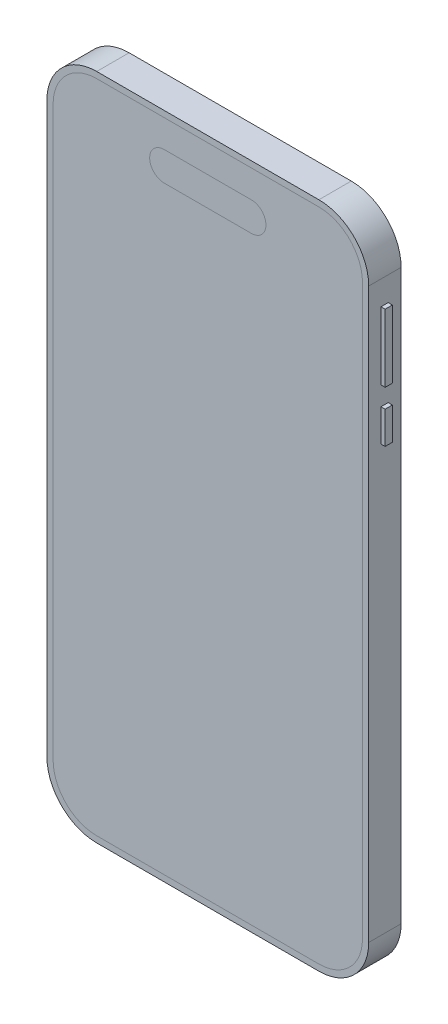
ISO-10303-21;
HEADER;
FILE_DESCRIPTION(('STEP AP214'),'2;1');
FILE_NAME('part.step','',(''),(''),'','','');
FILE_SCHEMA(('AUTOMOTIVE_DESIGN { 1 0 10303 214 1 1 1 1 }'));
ENDSEC;
DATA;
#1=APPLICATION_CONTEXT('core data for automotive mechanical design processes');
#2=APPLICATION_PROTOCOL_DEFINITION('international standard','automotive_design',2000,#1);
#3=PRODUCT_CONTEXT('',#1,'mechanical');
#4=PRODUCT('Part','Part','',(#3));
#5=PRODUCT_RELATED_PRODUCT_CATEGORY('part','',(#4));
#6=PRODUCT_DEFINITION_FORMATION('','',#4);
#7=PRODUCT_DEFINITION_CONTEXT('part definition',#1,'design');
#8=PRODUCT_DEFINITION('design','',#6,#7);
#9=PRODUCT_DEFINITION_SHAPE('','',#8);
#10=(LENGTH_UNIT() NAMED_UNIT(*) SI_UNIT(.MILLI.,.METRE.));
#11=(NAMED_UNIT(*) PLANE_ANGLE_UNIT() SI_UNIT($,.RADIAN.));
#12=(NAMED_UNIT(*) SI_UNIT($,.STERADIAN.) SOLID_ANGLE_UNIT());
#13=UNCERTAINTY_MEASURE_WITH_UNIT(LENGTH_MEASURE(1.E-05),#10,'distance_accuracy_value','');
#14=(GEOMETRIC_REPRESENTATION_CONTEXT(3) GLOBAL_UNCERTAINTY_ASSIGNED_CONTEXT((#13)) GLOBAL_UNIT_ASSIGNED_CONTEXT((#10,
#11,#12)) REPRESENTATION_CONTEXT('',''));
#15=CARTESIAN_POINT('',(0.,0.,0.));
#16=DIRECTION('',(0.,0.,1.));
#17=DIRECTION('',(1.,0.,0.));
#18=AXIS2_PLACEMENT_3D('',#15,#16,#17);
#19=CARTESIAN_POINT('',(38.75,-68.4499999999999,7.8));
#20=DIRECTION('',(-1.,0.,0.));
#21=DIRECTION('',(0.,0.,1.));
#22=AXIS2_PLACEMENT_3D('',#19,#20,#21);
#23=PLANE('',#22);
#24=DIRECTION('',(0.,1.,0.));
#25=VECTOR('',#24,1.);
#26=CARTESIAN_POINT('',(38.75,62.6491277311448,3.10781748503283));
#27=LINE('',#26,#25);
#28=CARTESIAN_POINT('',(38.75,46.3441915152805,3.10781748503283));
#29=VERTEX_POINT('',#28);
#30=CARTESIAN_POINT('',(38.75,62.6491277311448,3.10781748503283));
#31=VERTEX_POINT('',#30);
#32=EDGE_CURVE('E247',#29,#31,#27,.T.);
#33=ORIENTED_EDGE('',*,*,#32,.F.);
#34=DIRECTION('',(0.,0.,-1.));
#35=VECTOR('',#34,1.);
#36=CARTESIAN_POINT('',(38.75,46.3441915152805,4.84021695796844));
#37=LINE('',#36,#35);
#38=CARTESIAN_POINT('',(38.75,46.3441915152805,4.84021695796844));
#39=VERTEX_POINT('',#38);
#40=EDGE_CURVE('E280',#39,#29,#37,.T.);
#41=ORIENTED_EDGE('',*,*,#40,.F.);
#42=DIRECTION('',(0.,-1.,0.));
#43=VECTOR('',#42,1.);
#44=CARTESIAN_POINT('',(38.75,62.6491277311448,4.84021695796844));
#45=LINE('',#44,#43);
#46=CARTESIAN_POINT('',(38.75,62.6491277311448,4.84021695796844));
#47=VERTEX_POINT('',#46);
#48=EDGE_CURVE('E292',#47,#39,#45,.T.);
#49=ORIENTED_EDGE('',*,*,#48,.F.);
#50=DIRECTION('',(0.,0.,1.));
#51=VECTOR('',#50,1.);
#52=CARTESIAN_POINT('',(38.75,62.6491277311448,4.84021695796844));
#53=LINE('',#52,#51);
#54=EDGE_CURVE('E289',#31,#47,#53,.T.);
#55=ORIENTED_EDGE('',*,*,#54,.F.);
#56=EDGE_LOOP('',(#33,#41,#49,#55));
#57=FACE_BOUND('',#56,.T.);
#58=DIRECTION('',(0.,1.,0.));
#59=VECTOR('',#58,1.);
#60=CARTESIAN_POINT('',(38.75,-68.4499999999999,0.));
#61=LINE('',#60,#59);
#62=CARTESIAN_POINT('',(38.75,-68.4499999999999,0.));
#63=VERTEX_POINT('',#62);
#64=CARTESIAN_POINT('',(38.75,68.4499999999999,0.));
#65=VERTEX_POINT('',#64);
#66=EDGE_CURVE('E409',#63,#65,#61,.T.);
#67=ORIENTED_EDGE('',*,*,#66,.T.);
#68=DIRECTION('',(0.,0.,-1.));
#69=VECTOR('',#68,1.);
#70=CARTESIAN_POINT('',(38.75,68.4499999999999,7.8));
#71=LINE('',#70,#69);
#72=CARTESIAN_POINT('',(38.75,68.4499999999999,7.8));
#73=VERTEX_POINT('',#72);
#74=EDGE_CURVE('E439',#73,#65,#71,.T.);
#75=ORIENTED_EDGE('',*,*,#74,.F.);
#76=DIRECTION('',(0.,1.,0.));
#77=VECTOR('',#76,1.);
#78=CARTESIAN_POINT('',(38.75,-68.4499999999999,7.8));
#79=LINE('',#78,#77);
#80=CARTESIAN_POINT('',(38.75,-68.4499999999999,7.8));
#81=VERTEX_POINT('',#80);
#82=EDGE_CURVE('E391',#81,#73,#79,.T.);
#83=ORIENTED_EDGE('',*,*,#82,.F.);
#84=DIRECTION('',(0.,0.,-1.));
#85=VECTOR('',#84,1.);
#86=CARTESIAN_POINT('',(38.75,-68.4499999999999,7.8));
#87=LINE('',#86,#85);
#88=EDGE_CURVE('E442',#81,#63,#87,.T.);
#89=ORIENTED_EDGE('',*,*,#88,.T.);
#90=EDGE_LOOP('',(#67,#75,#83,#89));
#91=FACE_BOUND('',#90,.T.);
#92=DIRECTION('',(0.,1.,0.));
#93=VECTOR('',#92,1.);
#94=CARTESIAN_POINT('',(38.75,34.014462440001,3.10781748503283));
#95=LINE('',#94,#93);
#96=CARTESIAN_POINT('',(38.75,34.014462440001,3.10781748503283));
#97=VERTEX_POINT('',#96);
#98=CARTESIAN_POINT('',(38.75,41.7959932490222,3.10781748503283));
#99=VERTEX_POINT('',#98);
#100=EDGE_CURVE('E241',#97,#99,#95,.T.);
#101=ORIENTED_EDGE('',*,*,#100,.F.);
#102=DIRECTION('',(0.,0.,-1.));
#103=VECTOR('',#102,1.);
#104=CARTESIAN_POINT('',(38.75,34.014462440001,4.84021695796844));
#105=LINE('',#104,#103);
#106=CARTESIAN_POINT('',(38.75,34.014462440001,4.84021695796844));
#107=VERTEX_POINT('',#106);
#108=EDGE_CURVE('E243',#107,#97,#105,.T.);
#109=ORIENTED_EDGE('',*,*,#108,.F.);
#110=DIRECTION('',(0.,-1.,0.));
#111=VECTOR('',#110,1.);
#112=CARTESIAN_POINT('',(38.75,34.014462440001,4.84021695796844));
#113=LINE('',#112,#111);
#114=CARTESIAN_POINT('',(38.75,41.7959932490222,4.84021695796844));
#115=VERTEX_POINT('',#114);
#116=EDGE_CURVE('E68',#115,#107,#113,.T.);
#117=ORIENTED_EDGE('',*,*,#116,.F.);
#118=DIRECTION('',(0.,0.,1.));
#119=VECTOR('',#118,1.);
#120=CARTESIAN_POINT('',(38.75,41.7959932490222,4.84021695796844));
#121=LINE('',#120,#119);
#122=EDGE_CURVE('E63',#99,#115,#121,.T.);
#123=ORIENTED_EDGE('',*,*,#122,.F.);
#124=EDGE_LOOP('',(#101,#109,#117,#123));
#125=FACE_BOUND('',#124,.T.);
#126=ADVANCED_FACE('F47',(#57,#91,#125),#23,.F.);
#127=CARTESIAN_POINT('',(0.,0.,-4.));
#128=DIRECTION('',(0.,0.,-1.));
#129=DIRECTION('',(-1.,0.,0.));
#130=AXIS2_PLACEMENT_3D('',#127,#128,#129);
#131=PLANE('',#130);
#132=CARTESIAN_POINT('',(24.5442286340599,47.45,-4.));
#133=DIRECTION('',(0.,0.,-1.));
#134=DIRECTION('',(-1.,0.,0.));
#135=AXIS2_PLACEMENT_3D('',#132,#133,#134);
#136=CIRCLE('',#135,7.5);
#137=CARTESIAN_POINT('',(17.0442286340599,47.45,-4.));
#138=VERTEX_POINT('',#137);
#139=EDGE_CURVE('E316',#138,#138,#136,.T.);
#140=ORIENTED_EDGE('',*,*,#139,.T.);
#141=EDGE_LOOP('',(#140));
#142=FACE_BOUND('',#141,.T.);
#143=CARTESIAN_POINT('',(24.5442286340599,47.45,-4.));
#144=DIRECTION('',(0.,0.,-1.));
#145=DIRECTION('',(-1.,0.,0.));
#146=AXIS2_PLACEMENT_3D('',#143,#144,#145);
#147=CIRCLE('',#146,6.5);
#148=CARTESIAN_POINT('',(18.0442286340599,47.45,-4.));
#149=VERTEX_POINT('',#148);
#150=EDGE_CURVE('E11',#149,#149,#147,.F.);
#151=ORIENTED_EDGE('',*,*,#150,.T.);
#152=EDGE_LOOP('',(#151));
#153=FACE_BOUND('',#152,.T.);
#154=ADVANCED_FACE('F527',(#142,#153),#131,.T.);
#155=CARTESIAN_POINT('',(0.,0.,-4.));
#156=DIRECTION('',(0.,0.,-1.));
#157=DIRECTION('',(-1.,0.,0.));
#158=AXIS2_PLACEMENT_3D('',#155,#156,#157);
#159=PLANE('',#158);
#160=CARTESIAN_POINT('',(8.95577136594005,56.45,-4.));
#161=DIRECTION('',(0.,0.,-1.));
#162=DIRECTION('',(-1.,0.,0.));
#163=AXIS2_PLACEMENT_3D('',#160,#161,#162);
#164=CIRCLE('',#163,7.5);
#165=CARTESIAN_POINT('',(1.45577136594005,56.45,-4.));
#166=VERTEX_POINT('',#165);
#167=EDGE_CURVE('E312',#166,#166,#164,.T.);
#168=ORIENTED_EDGE('',*,*,#167,.T.);
#169=EDGE_LOOP('',(#168));
#170=FACE_BOUND('',#169,.T.);
#171=CARTESIAN_POINT('',(8.95577136594005,56.45,-4.));
#172=DIRECTION('',(0.,0.,-1.));
#173=DIRECTION('',(-1.,0.,0.));
#174=AXIS2_PLACEMENT_3D('',#171,#172,#173);
#175=CIRCLE('',#174,6.5);
#176=CARTESIAN_POINT('',(2.45577136594005,56.45,-4.));
#177=VERTEX_POINT('',#176);
#178=EDGE_CURVE('E56',#177,#177,#175,.F.);
#179=ORIENTED_EDGE('',*,*,#178,.T.);
#180=EDGE_LOOP('',(#179));
#181=FACE_BOUND('',#180,.T.);
#182=ADVANCED_FACE('F508',(#170,#181),#159,.T.);
#183=CARTESIAN_POINT('',(0.,0.,-4.));
#184=DIRECTION('',(0.,0.,-1.));
#185=DIRECTION('',(-1.,0.,0.));
#186=AXIS2_PLACEMENT_3D('',#183,#184,#185);
#187=PLANE('',#186);
#188=CARTESIAN_POINT('',(24.5442286340599,65.45,-4.));
#189=DIRECTION('',(0.,0.,-1.));
#190=DIRECTION('',(-1.,0.,0.));
#191=AXIS2_PLACEMENT_3D('',#188,#189,#190);
#192=CIRCLE('',#191,7.5);
#193=CARTESIAN_POINT('',(17.0442286340599,65.45,-4.));
#194=VERTEX_POINT('',#193);
#195=EDGE_CURVE('E320',#194,#194,#192,.T.);
#196=ORIENTED_EDGE('',*,*,#195,.T.);
#197=EDGE_LOOP('',(#196));
#198=FACE_BOUND('',#197,.T.);
#199=CARTESIAN_POINT('',(24.5442286340599,65.45,-4.));
#200=DIRECTION('',(0.,0.,-1.));
#201=DIRECTION('',(-1.,0.,0.));
#202=AXIS2_PLACEMENT_3D('',#199,#200,#201);
#203=CIRCLE('',#202,6.5);
#204=CARTESIAN_POINT('',(18.0442286340599,65.45,-4.));
#205=VERTEX_POINT('',#204);
#206=EDGE_CURVE('E491',#205,#205,#203,.F.);
#207=ORIENTED_EDGE('',*,*,#206,.T.);
#208=EDGE_LOOP('',(#207));
#209=FACE_BOUND('',#208,.T.);
#210=ADVANCED_FACE('F526',(#198,#209),#187,.T.);
#211=CARTESIAN_POINT('',(26.75,-68.45,7.8));
#212=DIRECTION('',(0.,0.,1.));
#213=DIRECTION('',(1.,0.,0.));
#214=AXIS2_PLACEMENT_3D('',#211,#212,#213);
#215=PLANE('',#214);
#216=CARTESIAN_POINT('',(26.75,-68.45,7.8));
#217=DIRECTION('',(0.,0.,1.));
#218=DIRECTION('',(1.,0.,0.));
#219=AXIS2_PLACEMENT_3D('',#216,#217,#218);
#220=CIRCLE('',#219,12.);
#221=CARTESIAN_POINT('',(26.7499999999999,-80.45,7.8));
#222=VERTEX_POINT('',#221);
#223=EDGE_CURVE('E388',#222,#81,#220,.T.);
#224=ORIENTED_EDGE('',*,*,#223,.T.);
#225=ORIENTED_EDGE('',*,*,#82,.T.);
#226=CARTESIAN_POINT('',(26.75,68.45,7.8));
#227=DIRECTION('',(0.,0.,1.));
#228=DIRECTION('',(-1.,0.,0.));
#229=AXIS2_PLACEMENT_3D('',#226,#227,#228);
#230=CIRCLE('',#229,12.);
#231=CARTESIAN_POINT('',(26.7499999999999,80.45,7.8));
#232=VERTEX_POINT('',#231);
#233=EDGE_CURVE('E394',#73,#232,#230,.T.);
#234=ORIENTED_EDGE('',*,*,#233,.T.);
#235=DIRECTION('',(-1.,0.,0.));
#236=VECTOR('',#235,1.);
#237=CARTESIAN_POINT('',(-26.7499999999999,80.45,7.8));
#238=LINE('',#237,#236);
#239=CARTESIAN_POINT('',(-26.7499999999999,80.45,7.8));
#240=VERTEX_POINT('',#239);
#241=EDGE_CURVE('E396',#232,#240,#238,.T.);
#242=ORIENTED_EDGE('',*,*,#241,.T.);
#243=CARTESIAN_POINT('',(-26.75,68.45,7.8));
#244=DIRECTION('',(0.,0.,1.));
#245=DIRECTION('',(-1.,0.,0.));
#246=AXIS2_PLACEMENT_3D('',#243,#244,#245);
#247=CIRCLE('',#246,12.);
#248=CARTESIAN_POINT('',(-38.75,68.4499999999999,7.8));
#249=VERTEX_POINT('',#248);
#250=EDGE_CURVE('E398',#240,#249,#247,.T.);
#251=ORIENTED_EDGE('',*,*,#250,.T.);
#252=DIRECTION('',(0.,-1.,0.));
#253=VECTOR('',#252,1.);
#254=CARTESIAN_POINT('',(-38.75,-68.4499999999999,7.8));
#255=LINE('',#254,#253);
#256=CARTESIAN_POINT('',(-38.75,-68.45,7.8));
#257=VERTEX_POINT('',#256);
#258=EDGE_CURVE('E400',#249,#257,#255,.T.);
#259=ORIENTED_EDGE('',*,*,#258,.T.);
#260=CARTESIAN_POINT('',(-26.75,-68.45,7.8));
#261=DIRECTION('',(0.,0.,1.));
#262=DIRECTION('',(-1.,0.,0.));
#263=AXIS2_PLACEMENT_3D('',#260,#261,#262);
#264=CIRCLE('',#263,12.);
#265=CARTESIAN_POINT('',(-26.7499999999999,-80.45,7.8));
#266=VERTEX_POINT('',#265);
#267=EDGE_CURVE('E402',#257,#266,#264,.T.);
#268=ORIENTED_EDGE('',*,*,#267,.T.);
#269=DIRECTION('',(1.,0.,0.));
#270=VECTOR('',#269,1.);
#271=CARTESIAN_POINT('',(-26.7499999999999,-80.45,7.8));
#272=LINE('',#271,#270);
#273=EDGE_CURVE('E404',#266,#222,#272,.T.);
#274=ORIENTED_EDGE('',*,*,#273,.T.);
#275=EDGE_LOOP('',(#224,#225,#234,#242,#251,#259,#268,#274));
#276=FACE_BOUND('',#275,.T.);
#277=DIRECTION('',(0.,1.,0.));
#278=VECTOR('',#277,1.);
#279=CARTESIAN_POINT('',(-37.25,-68.45,7.8));
#280=LINE('',#279,#278);
#281=CARTESIAN_POINT('',(-37.25,-68.45,7.8));
#282=VERTEX_POINT('',#281);
#283=CARTESIAN_POINT('',(-37.25,68.4499999999999,7.8));
#284=VERTEX_POINT('',#283);
#285=EDGE_CURVE('E484',#282,#284,#280,.T.);
#286=ORIENTED_EDGE('',*,*,#285,.T.);
#287=CARTESIAN_POINT('',(-26.75,68.45,7.8));
#288=DIRECTION('',(0.,0.,1.));
#289=DIRECTION('',(1.,0.,0.));
#290=AXIS2_PLACEMENT_3D('',#287,#288,#289);
#291=CIRCLE('',#290,10.5);
#292=CARTESIAN_POINT('',(-26.7499999999999,78.95,7.8));
#293=VERTEX_POINT('',#292);
#294=EDGE_CURVE('E488',#284,#293,#291,.F.);
#295=ORIENTED_EDGE('',*,*,#294,.T.);
#296=DIRECTION('',(1.,0.,0.));
#297=VECTOR('',#296,1.);
#298=CARTESIAN_POINT('',(26.75,78.95,7.8));
#299=LINE('',#298,#297);
#300=CARTESIAN_POINT('',(26.7499999999999,78.95,7.8));
#301=VERTEX_POINT('',#300);
#302=EDGE_CURVE('E460',#293,#301,#299,.T.);
#303=ORIENTED_EDGE('',*,*,#302,.T.);
#304=CARTESIAN_POINT('',(26.75,68.45,7.8));
#305=DIRECTION('',(0.,0.,1.));
#306=DIRECTION('',(1.,0.,0.));
#307=AXIS2_PLACEMENT_3D('',#304,#305,#306);
#308=CIRCLE('',#307,10.5);
#309=CARTESIAN_POINT('',(37.25,68.45,7.8));
#310=VERTEX_POINT('',#309);
#311=EDGE_CURVE('E464',#301,#310,#308,.F.);
#312=ORIENTED_EDGE('',*,*,#311,.T.);
#313=DIRECTION('',(0.,-1.,0.));
#314=VECTOR('',#313,1.);
#315=CARTESIAN_POINT('',(37.25,-68.45,7.8));
#316=LINE('',#315,#314);
#317=CARTESIAN_POINT('',(37.25,-68.45,7.8));
#318=VERTEX_POINT('',#317);
#319=EDGE_CURVE('E468',#310,#318,#316,.T.);
#320=ORIENTED_EDGE('',*,*,#319,.T.);
#321=CARTESIAN_POINT('',(26.75,-68.45,7.8));
#322=DIRECTION('',(0.,0.,1.));
#323=DIRECTION('',(1.,0.,0.));
#324=AXIS2_PLACEMENT_3D('',#321,#322,#323);
#325=CIRCLE('',#324,10.5);
#326=CARTESIAN_POINT('',(26.7499999999999,-78.95,7.8));
#327=VERTEX_POINT('',#326);
#328=EDGE_CURVE('E472',#318,#327,#325,.F.);
#329=ORIENTED_EDGE('',*,*,#328,.T.);
#330=DIRECTION('',(-1.,0.,0.));
#331=VECTOR('',#330,1.);
#332=CARTESIAN_POINT('',(26.75,-78.95,7.8));
#333=LINE('',#332,#331);
#334=CARTESIAN_POINT('',(-26.7499999999999,-78.95,7.8));
#335=VERTEX_POINT('',#334);
#336=EDGE_CURVE('E476',#327,#335,#333,.T.);
#337=ORIENTED_EDGE('',*,*,#336,.T.);
#338=CARTESIAN_POINT('',(-26.75,-68.45,7.8));
#339=DIRECTION('',(0.,0.,1.));
#340=DIRECTION('',(1.,0.,0.));
#341=AXIS2_PLACEMENT_3D('',#338,#339,#340);
#342=CIRCLE('',#341,10.5);
#343=EDGE_CURVE('E480',#335,#282,#342,.F.);
#344=ORIENTED_EDGE('',*,*,#343,.T.);
#345=EDGE_LOOP('',(#286,#295,#303,#312,#320,#329,#337,#344));
#346=FACE_BOUND('',#345,.T.);
#347=ADVANCED_FACE('F572',(#276,#346),#215,.T.);
#348=ORIENTED_EDGE('',*,*,#294,.F.);
#349=ORIENTED_EDGE('',*,*,#285,.F.);
#350=ORIENTED_EDGE('',*,*,#343,.F.);
#351=ORIENTED_EDGE('',*,*,#336,.F.);
#352=ORIENTED_EDGE('',*,*,#328,.F.);
#353=ORIENTED_EDGE('',*,*,#319,.F.);
#354=ORIENTED_EDGE('',*,*,#311,.F.);
#355=ORIENTED_EDGE('',*,*,#302,.F.);
#356=EDGE_LOOP('',(#348,#349,#350,#351,#352,#353,#354,#355));
#357=FACE_BOUND('',#356,.T.);
#358=DIRECTION('',(-1.,0.,0.));
#359=VECTOR('',#358,1.);
#360=CARTESIAN_POINT('',(26.7500000000001,65.3,7.8));
#361=LINE('',#360,#359);
#362=CARTESIAN_POINT('',(10.5,65.3,7.8));
#363=VERTEX_POINT('',#362);
#364=CARTESIAN_POINT('',(-10.5,65.3,7.8));
#365=VERTEX_POINT('',#364);
#366=EDGE_CURVE('E453',#363,#365,#361,.T.);
#367=ORIENTED_EDGE('',*,*,#366,.T.);
#368=CARTESIAN_POINT('',(-10.5,68.8,7.8));
#369=DIRECTION('',(0.,0.,1.));
#370=DIRECTION('',(1.,0.,0.));
#371=AXIS2_PLACEMENT_3D('',#368,#369,#370);
#372=CIRCLE('',#371,3.5);
#373=CARTESIAN_POINT('',(-10.5,72.3,7.8));
#374=VERTEX_POINT('',#373);
#375=EDGE_CURVE('E457',#365,#374,#372,.F.);
#376=ORIENTED_EDGE('',*,*,#375,.T.);
#377=DIRECTION('',(1.,0.,0.));
#378=VECTOR('',#377,1.);
#379=CARTESIAN_POINT('',(26.7499999999999,72.3,7.8));
#380=LINE('',#379,#378);
#381=CARTESIAN_POINT('',(10.5,72.3,7.8));
#382=VERTEX_POINT('',#381);
#383=EDGE_CURVE('E445',#374,#382,#380,.T.);
#384=ORIENTED_EDGE('',*,*,#383,.T.);
#385=CARTESIAN_POINT('',(10.5,68.8,7.8));
#386=DIRECTION('',(0.,0.,1.));
#387=DIRECTION('',(1.,0.,0.));
#388=AXIS2_PLACEMENT_3D('',#385,#386,#387);
#389=CIRCLE('',#388,3.50000000000002);
#390=EDGE_CURVE('E449',#382,#363,#389,.F.);
#391=ORIENTED_EDGE('',*,*,#390,.T.);
#392=EDGE_LOOP('',(#367,#376,#384,#391));
#393=FACE_BOUND('',#392,.T.);
#394=ADVANCED_FACE('F573',(#357,#393),#215,.T.);
#395=CARTESIAN_POINT('',(26.75,-68.45,7.8));
#396=DIRECTION('',(0.,0.,-1.));
#397=DIRECTION('',(-1.,0.,0.));
#398=AXIS2_PLACEMENT_3D('',#395,#396,#397);
#399=CYLINDRICAL_SURFACE('',#398,12.);
#400=CARTESIAN_POINT('',(26.75,-68.45,0.));
#401=DIRECTION('',(0.,0.,1.));
#402=DIRECTION('',(1.,0.,0.));
#403=AXIS2_PLACEMENT_3D('',#400,#401,#402);
#404=CIRCLE('',#403,12.);
#405=CARTESIAN_POINT('',(26.7499999999999,-80.45,0.));
#406=VERTEX_POINT('',#405);
#407=EDGE_CURVE('E387',#406,#63,#404,.T.);
#408=ORIENTED_EDGE('',*,*,#407,.T.);
#409=ORIENTED_EDGE('',*,*,#88,.F.);
#410=ORIENTED_EDGE('',*,*,#223,.F.);
#411=DIRECTION('',(0.,0.,-1.));
#412=VECTOR('',#411,1.);
#413=CARTESIAN_POINT('',(26.7499999999999,-80.45,7.8));
#414=LINE('',#413,#412);
#415=EDGE_CURVE('E406',#222,#406,#414,.T.);
#416=ORIENTED_EDGE('',*,*,#415,.T.);
#417=EDGE_LOOP('',(#408,#409,#410,#416));
#418=FACE_BOUND('',#417,.T.);
#419=ADVANCED_FACE('F49',(#418),#399,.T.);
#420=CARTESIAN_POINT('',(26.75,68.45,7.8));
#421=DIRECTION('',(0.,0.,-1.));
#422=DIRECTION('',(-1.,0.,0.));
#423=AXIS2_PLACEMENT_3D('',#420,#421,#422);
#424=CYLINDRICAL_SURFACE('',#423,12.);
#425=CARTESIAN_POINT('',(26.75,68.45,0.));
#426=DIRECTION('',(0.,0.,1.));
#427=DIRECTION('',(-1.,0.,0.));
#428=AXIS2_PLACEMENT_3D('',#425,#426,#427);
#429=CIRCLE('',#428,12.);
#430=CARTESIAN_POINT('',(26.7499999999999,80.45,0.));
#431=VERTEX_POINT('',#430);
#432=EDGE_CURVE('E411',#65,#431,#429,.T.);
#433=ORIENTED_EDGE('',*,*,#432,.T.);
#434=DIRECTION('',(0.,0.,-1.));
#435=VECTOR('',#434,1.);
#436=CARTESIAN_POINT('',(26.7499999999999,80.45,7.8));
#437=LINE('',#436,#435);
#438=EDGE_CURVE('E436',#232,#431,#437,.T.);
#439=ORIENTED_EDGE('',*,*,#438,.F.);
#440=ORIENTED_EDGE('',*,*,#233,.F.);
#441=ORIENTED_EDGE('',*,*,#74,.T.);
#442=EDGE_LOOP('',(#433,#439,#440,#441));
#443=FACE_BOUND('',#442,.T.);
#444=ADVANCED_FACE('F539',(#443),#424,.T.);
#445=CARTESIAN_POINT('',(-26.7499999999999,80.45,7.8));
#446=DIRECTION('',(0.,-1.,0.));
#447=DIRECTION('',(0.,0.,-1.));
#448=AXIS2_PLACEMENT_3D('',#445,#446,#447);
#449=PLANE('',#448);
#450=DIRECTION('',(-1.,0.,0.));
#451=VECTOR('',#450,1.);
#452=CARTESIAN_POINT('',(-26.7499999999999,80.45,0.));
#453=LINE('',#452,#451);
#454=CARTESIAN_POINT('',(-26.7499999999999,80.45,0.));
#455=VERTEX_POINT('',#454);
#456=EDGE_CURVE('E413',#431,#455,#453,.T.);
#457=ORIENTED_EDGE('',*,*,#456,.T.);
#458=DIRECTION('',(0.,0.,-1.));
#459=VECTOR('',#458,1.);
#460=CARTESIAN_POINT('',(-26.7499999999999,80.45,7.8));
#461=LINE('',#460,#459);
#462=EDGE_CURVE('E433',#240,#455,#461,.T.);
#463=ORIENTED_EDGE('',*,*,#462,.F.);
#464=ORIENTED_EDGE('',*,*,#241,.F.);
#465=ORIENTED_EDGE('',*,*,#438,.T.);
#466=EDGE_LOOP('',(#457,#463,#464,#465));
#467=FACE_BOUND('',#466,.T.);
#468=ADVANCED_FACE('F542',(#467),#449,.F.);
#469=CARTESIAN_POINT('',(-26.75,68.45,7.8));
#470=DIRECTION('',(0.,0.,-1.));
#471=DIRECTION('',(-1.,0.,0.));
#472=AXIS2_PLACEMENT_3D('',#469,#470,#471);
#473=CYLINDRICAL_SURFACE('',#472,12.);
#474=CARTESIAN_POINT('',(-26.75,68.45,0.));
#475=DIRECTION('',(0.,0.,1.));
#476=DIRECTION('',(-1.,0.,0.));
#477=AXIS2_PLACEMENT_3D('',#474,#475,#476);
#478=CIRCLE('',#477,12.);
#479=CARTESIAN_POINT('',(-38.75,68.4499999999999,0.));
#480=VERTEX_POINT('',#479);
#481=EDGE_CURVE('E415',#455,#480,#478,.T.);
#482=ORIENTED_EDGE('',*,*,#481,.T.);
#483=DIRECTION('',(0.,0.,-1.));
#484=VECTOR('',#483,1.);
#485=CARTESIAN_POINT('',(-38.75,68.4499999999999,7.8));
#486=LINE('',#485,#484);
#487=EDGE_CURVE('E430',#249,#480,#486,.T.);
#488=ORIENTED_EDGE('',*,*,#487,.F.);
#489=ORIENTED_EDGE('',*,*,#250,.F.);
#490=ORIENTED_EDGE('',*,*,#462,.T.);
#491=EDGE_LOOP('',(#482,#488,#489,#490));
#492=FACE_BOUND('',#491,.T.);
#493=ADVANCED_FACE('F546',(#492),#473,.T.);
#494=CARTESIAN_POINT('',(-38.75,-68.4499999999999,7.8));
#495=DIRECTION('',(1.,0.,0.));
#496=DIRECTION('',(0.,0.,-1.));
#497=AXIS2_PLACEMENT_3D('',#494,#495,#496);
#498=PLANE('',#497);
#499=DIRECTION('',(0.,-1.,0.));
#500=VECTOR('',#499,1.);
#501=CARTESIAN_POINT('',(-38.75,-68.4499999999999,0.));
#502=LINE('',#501,#500);
#503=CARTESIAN_POINT('',(-38.75,-68.45,0.));
#504=VERTEX_POINT('',#503);
#505=EDGE_CURVE('E417',#480,#504,#502,.T.);
#506=ORIENTED_EDGE('',*,*,#505,.T.);
#507=DIRECTION('',(0.,0.,-1.));
#508=VECTOR('',#507,1.);
#509=CARTESIAN_POINT('',(-38.75,-68.45,7.8));
#510=LINE('',#509,#508);
#511=EDGE_CURVE('E427',#257,#504,#510,.T.);
#512=ORIENTED_EDGE('',*,*,#511,.F.);
#513=ORIENTED_EDGE('',*,*,#258,.F.);
#514=ORIENTED_EDGE('',*,*,#487,.T.);
#515=EDGE_LOOP('',(#506,#512,#513,#514));
#516=FACE_BOUND('',#515,.T.);
#517=ADVANCED_FACE('F550',(#516),#498,.F.);
#518=CARTESIAN_POINT('',(-26.75,-68.45,7.8));
#519=DIRECTION('',(0.,0.,-1.));
#520=DIRECTION('',(-1.,0.,0.));
#521=AXIS2_PLACEMENT_3D('',#518,#519,#520);
#522=CYLINDRICAL_SURFACE('',#521,12.);
#523=CARTESIAN_POINT('',(-26.75,-68.45,0.));
#524=DIRECTION('',(0.,0.,1.));
#525=DIRECTION('',(-1.,0.,0.));
#526=AXIS2_PLACEMENT_3D('',#523,#524,#525);
#527=CIRCLE('',#526,12.);
#528=CARTESIAN_POINT('',(-26.7499999999999,-80.45,0.));
#529=VERTEX_POINT('',#528);
#530=EDGE_CURVE('E419',#504,#529,#527,.T.);
#531=ORIENTED_EDGE('',*,*,#530,.T.);
#532=DIRECTION('',(0.,0.,-1.));
#533=VECTOR('',#532,1.);
#534=CARTESIAN_POINT('',(-26.7499999999999,-80.45,7.8));
#535=LINE('',#534,#533);
#536=EDGE_CURVE('E424',#266,#529,#535,.T.);
#537=ORIENTED_EDGE('',*,*,#536,.F.);
#538=ORIENTED_EDGE('',*,*,#267,.F.);
#539=ORIENTED_EDGE('',*,*,#511,.T.);
#540=EDGE_LOOP('',(#531,#537,#538,#539));
#541=FACE_BOUND('',#540,.T.);
#542=ADVANCED_FACE('F554',(#541),#522,.T.);
#543=CARTESIAN_POINT('',(-26.7499999999999,-80.45,7.8));
#544=DIRECTION('',(0.,1.,0.));
#545=DIRECTION('',(0.,0.,1.));
#546=AXIS2_PLACEMENT_3D('',#543,#544,#545);
#547=PLANE('',#546);
#548=DIRECTION('',(1.,0.,0.));
#549=VECTOR('',#548,1.);
#550=CARTESIAN_POINT('',(-26.7499999999999,-80.45,0.));
#551=LINE('',#550,#549);
#552=EDGE_CURVE('E392',#529,#406,#551,.T.);
#553=ORIENTED_EDGE('',*,*,#552,.T.);
#554=ORIENTED_EDGE('',*,*,#415,.F.);
#555=ORIENTED_EDGE('',*,*,#273,.F.);
#556=ORIENTED_EDGE('',*,*,#536,.T.);
#557=EDGE_LOOP('',(#553,#554,#555,#556));
#558=FACE_BOUND('',#557,.T.);
#559=ADVANCED_FACE('F558',(#558),#547,.F.);
#560=ORIENTED_EDGE('',*,*,#375,.F.);
#561=ORIENTED_EDGE('',*,*,#366,.F.);
#562=ORIENTED_EDGE('',*,*,#390,.F.);
#563=ORIENTED_EDGE('',*,*,#383,.F.);
#564=EDGE_LOOP('',(#560,#561,#562,#563));
#565=FACE_BOUND('',#564,.T.);
#566=ADVANCED_FACE('F562',(#565),#215,.T.);
#567=CARTESIAN_POINT('',(26.75,-68.45,0.));
#568=DIRECTION('',(0.,0.,1.));
#569=DIRECTION('',(1.,0.,0.));
#570=AXIS2_PLACEMENT_3D('',#567,#568,#569);
#571=PLANE('',#570);
#572=DIRECTION('',(0.,1.,0.));
#573=VECTOR('',#572,1.);
#574=CARTESIAN_POINT('',(35.75,0.,0.));
#575=LINE('',#574,#573);
#576=CARTESIAN_POINT('',(35.75,45.4500000000001,0.));
#577=VERTEX_POINT('',#576);
#578=CARTESIAN_POINT('',(35.75,67.45,0.));
#579=VERTEX_POINT('',#578);
#580=EDGE_CURVE('E351',#577,#579,#575,.T.);
#581=ORIENTED_EDGE('',*,*,#580,.T.);
#582=CARTESIAN_POINT('',(27.75,67.45,0.));
#583=DIRECTION('',(0.,0.,-1.));
#584=DIRECTION('',(-1.,0.,0.));
#585=AXIS2_PLACEMENT_3D('',#582,#583,#584);
#586=CIRCLE('',#585,8.);
#587=CARTESIAN_POINT('',(27.7499999999999,75.45,0.));
#588=VERTEX_POINT('',#587);
#589=EDGE_CURVE('E348',#579,#588,#586,.F.);
#590=ORIENTED_EDGE('',*,*,#589,.T.);
#591=DIRECTION('',(-1.,0.,0.));
#592=VECTOR('',#591,1.);
#593=CARTESIAN_POINT('',(0.,75.45,0.));
#594=LINE('',#593,#592);
#595=CARTESIAN_POINT('',(5.75000000000005,75.45,0.));
#596=VERTEX_POINT('',#595);
#597=EDGE_CURVE('E328',#588,#596,#594,.T.);
#598=ORIENTED_EDGE('',*,*,#597,.T.);
#599=CARTESIAN_POINT('',(5.75,67.45,0.));
#600=DIRECTION('',(0.,0.,-1.));
#601=DIRECTION('',(-1.,0.,0.));
#602=AXIS2_PLACEMENT_3D('',#599,#600,#601);
#603=CIRCLE('',#602,8.);
#604=CARTESIAN_POINT('',(-2.25,67.45,0.));
#605=VERTEX_POINT('',#604);
#606=EDGE_CURVE('E366',#596,#605,#603,.F.);
#607=ORIENTED_EDGE('',*,*,#606,.T.);
#608=DIRECTION('',(0.,1.,0.));
#609=VECTOR('',#608,1.);
#610=CARTESIAN_POINT('',(-2.25,0.,0.));
#611=LINE('',#610,#609);
#612=CARTESIAN_POINT('',(-2.25,45.4500000000001,0.));
#613=VERTEX_POINT('',#612);
#614=EDGE_CURVE('E363',#613,#605,#611,.T.);
#615=ORIENTED_EDGE('',*,*,#614,.F.);
#616=CARTESIAN_POINT('',(5.75,45.45,0.));
#617=DIRECTION('',(0.,0.,-1.));
#618=DIRECTION('',(-1.,0.,0.));
#619=AXIS2_PLACEMENT_3D('',#616,#617,#618);
#620=CIRCLE('',#619,8.);
#621=CARTESIAN_POINT('',(5.75000000000006,37.45,0.));
#622=VERTEX_POINT('',#621);
#623=EDGE_CURVE('E360',#613,#622,#620,.F.);
#624=ORIENTED_EDGE('',*,*,#623,.T.);
#625=DIRECTION('',(-1.,0.,0.));
#626=VECTOR('',#625,1.);
#627=CARTESIAN_POINT('',(0.,37.45,0.));
#628=LINE('',#627,#626);
#629=CARTESIAN_POINT('',(27.7499999999999,37.45,0.));
#630=VERTEX_POINT('',#629);
#631=EDGE_CURVE('E357',#630,#622,#628,.T.);
#632=ORIENTED_EDGE('',*,*,#631,.F.);
#633=CARTESIAN_POINT('',(27.75,45.45,0.));
#634=DIRECTION('',(0.,0.,-1.));
#635=DIRECTION('',(-1.,0.,0.));
#636=AXIS2_PLACEMENT_3D('',#633,#634,#635);
#637=CIRCLE('',#636,8.);
#638=EDGE_CURVE('E354',#630,#577,#637,.F.);
#639=ORIENTED_EDGE('',*,*,#638,.T.);
#640=EDGE_LOOP('',(#581,#590,#598,#607,#615,#624,#632,#639));
#641=FACE_BOUND('',#640,.T.);
#642=ORIENTED_EDGE('',*,*,#407,.F.);
#643=ORIENTED_EDGE('',*,*,#552,.F.);
#644=ORIENTED_EDGE('',*,*,#530,.F.);
#645=ORIENTED_EDGE('',*,*,#505,.F.);
#646=ORIENTED_EDGE('',*,*,#481,.F.);
#647=ORIENTED_EDGE('',*,*,#456,.F.);
#648=ORIENTED_EDGE('',*,*,#432,.F.);
#649=ORIENTED_EDGE('',*,*,#66,.F.);
#650=EDGE_LOOP('',(#642,#643,#644,#645,#646,#647,#648,#649));
#651=FACE_BOUND('',#650,.T.);
#652=ADVANCED_FACE('F564',(#641,#651),#571,.F.);
#653=CARTESIAN_POINT('',(27.75,67.45,-1.2));
#654=DIRECTION('',(0.,0.,1.));
#655=DIRECTION('',(1.,0.,0.));
#656=AXIS2_PLACEMENT_3D('',#653,#654,#655);
#657=CYLINDRICAL_SURFACE('',#656,8.);
#658=ORIENTED_EDGE('',*,*,#589,.F.);
#659=DIRECTION('',(0.,0.,1.));
#660=VECTOR('',#659,1.);
#661=CARTESIAN_POINT('',(35.75,67.45,-1.2));
#662=LINE('',#661,#660);
#663=CARTESIAN_POINT('',(35.75,67.45,-1.2));
#664=VERTEX_POINT('',#663);
#665=EDGE_CURVE('E385',#664,#579,#662,.T.);
#666=ORIENTED_EDGE('',*,*,#665,.F.);
#667=CARTESIAN_POINT('',(27.75,67.45,-1.2));
#668=DIRECTION('',(0.,0.,-1.));
#669=DIRECTION('',(-1.,0.,0.));
#670=AXIS2_PLACEMENT_3D('',#667,#668,#669);
#671=CIRCLE('',#670,8.);
#672=CARTESIAN_POINT('',(27.7499999999999,75.45,-1.2));
#673=VERTEX_POINT('',#672);
#674=EDGE_CURVE('E324',#664,#673,#671,.F.);
#675=ORIENTED_EDGE('',*,*,#674,.T.);
#676=DIRECTION('',(0.,0.,1.));
#677=VECTOR('',#676,1.);
#678=CARTESIAN_POINT('',(27.7499999999999,75.45,-1.2));
#679=LINE('',#678,#677);
#680=EDGE_CURVE('E347',#673,#588,#679,.T.);
#681=ORIENTED_EDGE('',*,*,#680,.T.);
#682=EDGE_LOOP('',(#658,#666,#675,#681));
#683=FACE_BOUND('',#682,.T.);
#684=ADVANCED_FACE('F567',(#683),#657,.T.);
#685=CARTESIAN_POINT('',(35.75,0.,-1.2));
#686=DIRECTION('',(1.,0.,0.));
#687=DIRECTION('',(0.,0.,-1.));
#688=AXIS2_PLACEMENT_3D('',#685,#686,#687);
#689=PLANE('',#688);
#690=ORIENTED_EDGE('',*,*,#580,.F.);
#691=DIRECTION('',(0.,0.,1.));
#692=VECTOR('',#691,1.);
#693=CARTESIAN_POINT('',(35.75,45.4500000000001,-1.2));
#694=LINE('',#693,#692);
#695=CARTESIAN_POINT('',(35.75,45.4500000000001,-1.2));
#696=VERTEX_POINT('',#695);
#697=EDGE_CURVE('E383',#696,#577,#694,.T.);
#698=ORIENTED_EDGE('',*,*,#697,.F.);
#699=DIRECTION('',(0.,1.,0.));
#700=VECTOR('',#699,1.);
#701=CARTESIAN_POINT('',(35.75,0.,-1.2));
#702=LINE('',#701,#700);
#703=EDGE_CURVE('E327',#696,#664,#702,.T.);
#704=ORIENTED_EDGE('',*,*,#703,.T.);
#705=ORIENTED_EDGE('',*,*,#665,.T.);
#706=EDGE_LOOP('',(#690,#698,#704,#705));
#707=FACE_BOUND('',#706,.T.);
#708=ADVANCED_FACE('F576',(#707),#689,.T.);
#709=CARTESIAN_POINT('',(27.75,45.45,-1.2));
#710=DIRECTION('',(0.,0.,1.));
#711=DIRECTION('',(1.,0.,0.));
#712=AXIS2_PLACEMENT_3D('',#709,#710,#711);
#713=CYLINDRICAL_SURFACE('',#712,8.);
#714=ORIENTED_EDGE('',*,*,#638,.F.);
#715=DIRECTION('',(0.,0.,1.));
#716=VECTOR('',#715,1.);
#717=CARTESIAN_POINT('',(27.7499999999999,37.45,-1.2));
#718=LINE('',#717,#716);
#719=CARTESIAN_POINT('',(27.7499999999999,37.45,-1.2));
#720=VERTEX_POINT('',#719);
#721=EDGE_CURVE('E381',#720,#630,#718,.T.);
#722=ORIENTED_EDGE('',*,*,#721,.F.);
#723=CARTESIAN_POINT('',(27.75,45.45,-1.2));
#724=DIRECTION('',(0.,0.,-1.));
#725=DIRECTION('',(-1.,0.,0.));
#726=AXIS2_PLACEMENT_3D('',#723,#724,#725);
#727=CIRCLE('',#726,8.);
#728=EDGE_CURVE('E331',#720,#696,#727,.F.);
#729=ORIENTED_EDGE('',*,*,#728,.T.);
#730=ORIENTED_EDGE('',*,*,#697,.T.);
#731=EDGE_LOOP('',(#714,#722,#729,#730));
#732=FACE_BOUND('',#731,.T.);
#733=ADVANCED_FACE('F580',(#732),#713,.T.);
#734=CARTESIAN_POINT('',(0.,37.45,-1.2));
#735=DIRECTION('',(0.,1.,0.));
#736=DIRECTION('',(0.,0.,1.));
#737=AXIS2_PLACEMENT_3D('',#734,#735,#736);
#738=PLANE('',#737);
#739=ORIENTED_EDGE('',*,*,#631,.T.);
#740=DIRECTION('',(0.,0.,1.));
#741=VECTOR('',#740,1.);
#742=CARTESIAN_POINT('',(5.75000000000006,37.45,-1.2));
#743=LINE('',#742,#741);
#744=CARTESIAN_POINT('',(5.75000000000006,37.45,-1.2));
#745=VERTEX_POINT('',#744);
#746=EDGE_CURVE('E379',#745,#622,#743,.T.);
#747=ORIENTED_EDGE('',*,*,#746,.F.);
#748=DIRECTION('',(-1.,0.,0.));
#749=VECTOR('',#748,1.);
#750=CARTESIAN_POINT('',(0.,37.45,-1.2));
#751=LINE('',#750,#749);
#752=EDGE_CURVE('E334',#720,#745,#751,.T.);
#753=ORIENTED_EDGE('',*,*,#752,.F.);
#754=ORIENTED_EDGE('',*,*,#721,.T.);
#755=EDGE_LOOP('',(#739,#747,#753,#754));
#756=FACE_BOUND('',#755,.T.);
#757=ADVANCED_FACE('F584',(#756),#738,.F.);
#758=CARTESIAN_POINT('',(5.75,45.45,-1.2));
#759=DIRECTION('',(0.,0.,1.));
#760=DIRECTION('',(1.,0.,0.));
#761=AXIS2_PLACEMENT_3D('',#758,#759,#760);
#762=CYLINDRICAL_SURFACE('',#761,8.);
#763=ORIENTED_EDGE('',*,*,#623,.F.);
#764=DIRECTION('',(0.,0.,1.));
#765=VECTOR('',#764,1.);
#766=CARTESIAN_POINT('',(-2.25,45.4500000000001,-1.2));
#767=LINE('',#766,#765);
#768=CARTESIAN_POINT('',(-2.25,45.4500000000001,-1.2));
#769=VERTEX_POINT('',#768);
#770=EDGE_CURVE('E377',#769,#613,#767,.T.);
#771=ORIENTED_EDGE('',*,*,#770,.F.);
#772=CARTESIAN_POINT('',(5.75,45.45,-1.2));
#773=DIRECTION('',(0.,0.,-1.));
#774=DIRECTION('',(-1.,0.,0.));
#775=AXIS2_PLACEMENT_3D('',#772,#773,#774);
#776=CIRCLE('',#775,8.);
#777=EDGE_CURVE('E336',#769,#745,#776,.F.);
#778=ORIENTED_EDGE('',*,*,#777,.T.);
#779=ORIENTED_EDGE('',*,*,#746,.T.);
#780=EDGE_LOOP('',(#763,#771,#778,#779));
#781=FACE_BOUND('',#780,.T.);
#782=ADVANCED_FACE('F588',(#781),#762,.T.);
#783=CARTESIAN_POINT('',(-2.25,0.,-1.2));
#784=DIRECTION('',(1.,0.,0.));
#785=DIRECTION('',(0.,0.,-1.));
#786=AXIS2_PLACEMENT_3D('',#783,#784,#785);
#787=PLANE('',#786);
#788=ORIENTED_EDGE('',*,*,#614,.T.);
#789=DIRECTION('',(0.,0.,1.));
#790=VECTOR('',#789,1.);
#791=CARTESIAN_POINT('',(-2.25,67.45,-1.2));
#792=LINE('',#791,#790);
#793=CARTESIAN_POINT('',(-2.25,67.45,-1.2));
#794=VERTEX_POINT('',#793);
#795=EDGE_CURVE('E375',#794,#605,#792,.T.);
#796=ORIENTED_EDGE('',*,*,#795,.F.);
#797=DIRECTION('',(0.,1.,0.));
#798=VECTOR('',#797,1.);
#799=CARTESIAN_POINT('',(-2.25,0.,-1.2));
#800=LINE('',#799,#798);
#801=EDGE_CURVE('E339',#769,#794,#800,.T.);
#802=ORIENTED_EDGE('',*,*,#801,.F.);
#803=ORIENTED_EDGE('',*,*,#770,.T.);
#804=EDGE_LOOP('',(#788,#796,#802,#803));
#805=FACE_BOUND('',#804,.T.);
#806=ADVANCED_FACE('F592',(#805),#787,.F.);
#807=CARTESIAN_POINT('',(5.75,67.45,-1.2));
#808=DIRECTION('',(0.,0.,1.));
#809=DIRECTION('',(1.,0.,0.));
#810=AXIS2_PLACEMENT_3D('',#807,#808,#809);
#811=CYLINDRICAL_SURFACE('',#810,8.);
#812=ORIENTED_EDGE('',*,*,#606,.F.);
#813=DIRECTION('',(0.,0.,1.));
#814=VECTOR('',#813,1.);
#815=CARTESIAN_POINT('',(5.75000000000005,75.45,-1.2));
#816=LINE('',#815,#814);
#817=CARTESIAN_POINT('',(5.75000000000005,75.45,-1.2));
#818=VERTEX_POINT('',#817);
#819=EDGE_CURVE('E372',#818,#596,#816,.T.);
#820=ORIENTED_EDGE('',*,*,#819,.F.);
#821=CARTESIAN_POINT('',(5.75,67.45,-1.2));
#822=DIRECTION('',(0.,0.,-1.));
#823=DIRECTION('',(-1.,0.,0.));
#824=AXIS2_PLACEMENT_3D('',#821,#822,#823);
#825=CIRCLE('',#824,8.);
#826=EDGE_CURVE('E341',#818,#794,#825,.F.);
#827=ORIENTED_EDGE('',*,*,#826,.T.);
#828=ORIENTED_EDGE('',*,*,#795,.T.);
#829=EDGE_LOOP('',(#812,#820,#827,#828));
#830=FACE_BOUND('',#829,.T.);
#831=ADVANCED_FACE('F596',(#830),#811,.T.);
#832=CARTESIAN_POINT('',(0.,75.45,-1.2));
#833=DIRECTION('',(0.,1.,0.));
#834=DIRECTION('',(-1.,0.,0.));
#835=AXIS2_PLACEMENT_3D('',#832,#833,#834);
#836=PLANE('',#835);
#837=ORIENTED_EDGE('',*,*,#597,.F.);
#838=ORIENTED_EDGE('',*,*,#680,.F.);
#839=DIRECTION('',(-1.,0.,0.));
#840=VECTOR('',#839,1.);
#841=CARTESIAN_POINT('',(0.,75.45,-1.2));
#842=LINE('',#841,#840);
#843=EDGE_CURVE('E344',#673,#818,#842,.T.);
#844=ORIENTED_EDGE('',*,*,#843,.T.);
#845=ORIENTED_EDGE('',*,*,#819,.T.);
#846=EDGE_LOOP('',(#837,#838,#844,#845));
#847=FACE_BOUND('',#846,.T.);
#848=ADVANCED_FACE('F600',(#847),#836,.T.);
#849=CARTESIAN_POINT('',(0.,0.,-1.2));
#850=DIRECTION('',(0.,0.,-1.));
#851=DIRECTION('',(-1.,0.,0.));
#852=AXIS2_PLACEMENT_3D('',#849,#850,#851);
#853=PLANE('',#852);
#854=CARTESIAN_POINT('',(8.95577136594005,68.45,-1.2));
#855=DIRECTION('',(0.,0.,-1.));
#856=DIRECTION('',(-1.,0.,0.));
#857=AXIS2_PLACEMENT_3D('',#854,#855,#856);
#858=CIRCLE('',#857,2.);
#859=CARTESIAN_POINT('',(6.95577136594004,68.45,-1.2));
#860=VERTEX_POINT('',#859);
#861=EDGE_CURVE('E311',#860,#860,#858,.F.);
#862=ORIENTED_EDGE('',*,*,#861,.T.);
#863=EDGE_LOOP('',(#862));
#864=FACE_BOUND('',#863,.T.);
#865=CARTESIAN_POINT('',(8.95577136594005,56.45,-1.2));
#866=DIRECTION('',(0.,0.,-1.));
#867=DIRECTION('',(-1.,0.,0.));
#868=AXIS2_PLACEMENT_3D('',#865,#866,#867);
#869=CIRCLE('',#868,7.5);
#870=CARTESIAN_POINT('',(1.45577136594005,56.45,-1.2));
#871=VERTEX_POINT('',#870);
#872=EDGE_CURVE('E315',#871,#871,#869,.F.);
#873=ORIENTED_EDGE('',*,*,#872,.T.);
#874=EDGE_LOOP('',(#873));
#875=FACE_BOUND('',#874,.T.);
#876=CARTESIAN_POINT('',(24.5442286340599,47.45,-1.2));
#877=DIRECTION('',(0.,0.,-1.));
#878=DIRECTION('',(-1.,0.,0.));
#879=AXIS2_PLACEMENT_3D('',#876,#877,#878);
#880=CIRCLE('',#879,7.5);
#881=CARTESIAN_POINT('',(17.0442286340599,47.45,-1.2));
#882=VERTEX_POINT('',#881);
#883=EDGE_CURVE('E319',#882,#882,#880,.F.);
#884=ORIENTED_EDGE('',*,*,#883,.T.);
#885=EDGE_LOOP('',(#884));
#886=FACE_BOUND('',#885,.T.);
#887=CARTESIAN_POINT('',(24.5442286340599,65.45,-1.2));
#888=DIRECTION('',(0.,0.,-1.));
#889=DIRECTION('',(-1.,0.,0.));
#890=AXIS2_PLACEMENT_3D('',#887,#888,#889);
#891=CIRCLE('',#890,7.5);
#892=CARTESIAN_POINT('',(17.0442286340599,65.45,-1.2));
#893=VERTEX_POINT('',#892);
#894=EDGE_CURVE('E323',#893,#893,#891,.F.);
#895=ORIENTED_EDGE('',*,*,#894,.T.);
#896=EDGE_LOOP('',(#895));
#897=FACE_BOUND('',#896,.T.);
#898=ORIENTED_EDGE('',*,*,#674,.F.);
#899=ORIENTED_EDGE('',*,*,#703,.F.);
#900=ORIENTED_EDGE('',*,*,#728,.F.);
#901=ORIENTED_EDGE('',*,*,#752,.T.);
#902=ORIENTED_EDGE('',*,*,#777,.F.);
#903=ORIENTED_EDGE('',*,*,#801,.T.);
#904=ORIENTED_EDGE('',*,*,#826,.F.);
#905=ORIENTED_EDGE('',*,*,#843,.F.);
#906=EDGE_LOOP('',(#898,#899,#900,#901,#902,#903,#904,#905));
#907=FACE_BOUND('',#906,.T.);
#908=ADVANCED_FACE('F604',(#864,#875,#886,#897,#907),#853,.T.);
#909=CARTESIAN_POINT('',(24.5442286340599,65.45,-4.));
#910=DIRECTION('',(0.,0.,1.));
#911=DIRECTION('',(1.,0.,0.));
#912=AXIS2_PLACEMENT_3D('',#909,#910,#911);
#913=CYLINDRICAL_SURFACE('',#912,7.5);
#914=ORIENTED_EDGE('',*,*,#894,.F.);
#915=EDGE_LOOP('',(#914));
#916=FACE_BOUND('',#915,.T.);
#917=ORIENTED_EDGE('',*,*,#195,.F.);
#918=EDGE_LOOP('',(#917));
#919=FACE_BOUND('',#918,.T.);
#920=ADVANCED_FACE('F608',(#916,#919),#913,.T.);
#921=ORIENTED_EDGE('',*,*,#206,.F.);
#922=EDGE_LOOP('',(#921));
#923=FACE_BOUND('',#922,.T.);
#924=ADVANCED_FACE('F612',(#923),#187,.T.);
#925=CARTESIAN_POINT('',(24.5442286340599,47.45,-4.));
#926=DIRECTION('',(0.,0.,1.));
#927=DIRECTION('',(1.,0.,0.));
#928=AXIS2_PLACEMENT_3D('',#925,#926,#927);
#929=CYLINDRICAL_SURFACE('',#928,7.5);
#930=ORIENTED_EDGE('',*,*,#883,.F.);
#931=EDGE_LOOP('',(#930));
#932=FACE_BOUND('',#931,.T.);
#933=ORIENTED_EDGE('',*,*,#139,.F.);
#934=EDGE_LOOP('',(#933));
#935=FACE_BOUND('',#934,.T.);
#936=ADVANCED_FACE('F616',(#932,#935),#929,.T.);
#937=ORIENTED_EDGE('',*,*,#150,.F.);
#938=EDGE_LOOP('',(#937));
#939=FACE_BOUND('',#938,.T.);
#940=ADVANCED_FACE('F522',(#939),#131,.T.);
#941=CARTESIAN_POINT('',(8.95577136594005,56.45,-4.));
#942=DIRECTION('',(0.,0.,1.));
#943=DIRECTION('',(1.,0.,0.));
#944=AXIS2_PLACEMENT_3D('',#941,#942,#943);
#945=CYLINDRICAL_SURFACE('',#944,7.5);
#946=ORIENTED_EDGE('',*,*,#872,.F.);
#947=EDGE_LOOP('',(#946));
#948=FACE_BOUND('',#947,.T.);
#949=ORIENTED_EDGE('',*,*,#167,.F.);
#950=EDGE_LOOP('',(#949));
#951=FACE_BOUND('',#950,.T.);
#952=ADVANCED_FACE('F513',(#948,#951),#945,.T.);
#953=ORIENTED_EDGE('',*,*,#178,.F.);
#954=EDGE_LOOP('',(#953));
#955=FACE_BOUND('',#954,.T.);
#956=ADVANCED_FACE('F510',(#955),#159,.T.);
#957=CARTESIAN_POINT('',(8.95577136594005,68.45,-2.));
#958=DIRECTION('',(0.,0.,1.));
#959=DIRECTION('',(1.,0.,0.));
#960=AXIS2_PLACEMENT_3D('',#957,#958,#959);
#961=CYLINDRICAL_SURFACE('',#960,2.);
#962=ORIENTED_EDGE('',*,*,#861,.F.);
#963=EDGE_LOOP('',(#962));
#964=FACE_BOUND('',#963,.T.);
#965=CARTESIAN_POINT('',(8.95577136594005,68.45,-2.));
#966=DIRECTION('',(0.,0.,-1.));
#967=DIRECTION('',(-1.,0.,0.));
#968=AXIS2_PLACEMENT_3D('',#965,#966,#967);
#969=CIRCLE('',#968,2.);
#970=CARTESIAN_POINT('',(6.95577136594004,68.45,-2.));
#971=VERTEX_POINT('',#970);
#972=EDGE_CURVE('E308',#971,#971,#969,.T.);
#973=ORIENTED_EDGE('',*,*,#972,.F.);
#974=EDGE_LOOP('',(#973));
#975=FACE_BOUND('',#974,.T.);
#976=ADVANCED_FACE('F512',(#964,#975),#961,.T.);
#977=CARTESIAN_POINT('',(0.,0.,-2.));
#978=DIRECTION('',(0.,0.,-1.));
#979=DIRECTION('',(-1.,0.,0.));
#980=AXIS2_PLACEMENT_3D('',#977,#978,#979);
#981=PLANE('',#980);
#982=ORIENTED_EDGE('',*,*,#972,.T.);
#983=EDGE_LOOP('',(#982));
#984=FACE_BOUND('',#983,.T.);
#985=ADVANCED_FACE('F519',(#984),#981,.T.);
#986=CARTESIAN_POINT('',(39.75,62.6491277311448,3.10781748503283));
#987=DIRECTION('',(0.,0.,1.));
#988=DIRECTION('',(1.,0.,0.));
#989=AXIS2_PLACEMENT_3D('',#986,#987,#988);
#990=PLANE('',#989);
#991=ORIENTED_EDGE('',*,*,#32,.T.);
#992=DIRECTION('',(-1.,0.,0.));
#993=VECTOR('',#992,1.);
#994=CARTESIAN_POINT('',(39.75,62.6491277311448,3.10781748503283));
#995=LINE('',#994,#993);
#996=CARTESIAN_POINT('',(39.75,62.6491277311448,3.10781748503283));
#997=VERTEX_POINT('',#996);
#998=EDGE_CURVE('E305',#997,#31,#995,.T.);
#999=ORIENTED_EDGE('',*,*,#998,.F.);
#1000=DIRECTION('',(0.,1.,0.));
#1001=VECTOR('',#1000,1.);
#1002=CARTESIAN_POINT('',(39.75,62.6491277311448,3.10781748503283));
#1003=LINE('',#1002,#1001);
#1004=CARTESIAN_POINT('',(39.75,46.3441915152805,3.10781748503283));
#1005=VERTEX_POINT('',#1004);
#1006=EDGE_CURVE('E276',#1005,#997,#1003,.T.);
#1007=ORIENTED_EDGE('',*,*,#1006,.F.);
#1008=DIRECTION('',(-1.,0.,0.));
#1009=VECTOR('',#1008,1.);
#1010=CARTESIAN_POINT('',(39.75,46.3441915152805,3.10781748503283));
#1011=LINE('',#1010,#1009);
#1012=EDGE_CURVE('E286',#1005,#29,#1011,.T.);
#1013=ORIENTED_EDGE('',*,*,#1012,.T.);
#1014=EDGE_LOOP('',(#991,#999,#1007,#1013));
#1015=FACE_BOUND('',#1014,.T.);
#1016=ADVANCED_FACE('F663',(#1015),#990,.F.);
#1017=CARTESIAN_POINT('',(39.75,62.6491277311448,4.84021695796844));
#1018=DIRECTION('',(0.,-1.,0.));
#1019=DIRECTION('',(0.,0.,-1.));
#1020=AXIS2_PLACEMENT_3D('',#1017,#1018,#1019);
#1021=PLANE('',#1020);
#1022=ORIENTED_EDGE('',*,*,#54,.T.);
#1023=DIRECTION('',(-1.,0.,0.));
#1024=VECTOR('',#1023,1.);
#1025=CARTESIAN_POINT('',(39.75,62.6491277311448,4.84021695796844));
#1026=LINE('',#1025,#1024);
#1027=CARTESIAN_POINT('',(39.75,62.6491277311448,4.84021695796844));
#1028=VERTEX_POINT('',#1027);
#1029=EDGE_CURVE('E302',#1028,#47,#1026,.T.);
#1030=ORIENTED_EDGE('',*,*,#1029,.F.);
#1031=DIRECTION('',(0.,0.,1.));
#1032=VECTOR('',#1031,1.);
#1033=CARTESIAN_POINT('',(39.75,62.6491277311448,4.84021695796844));
#1034=LINE('',#1033,#1032);
#1035=EDGE_CURVE('E279',#997,#1028,#1034,.T.);
#1036=ORIENTED_EDGE('',*,*,#1035,.F.);
#1037=ORIENTED_EDGE('',*,*,#998,.T.);
#1038=EDGE_LOOP('',(#1022,#1030,#1036,#1037));
#1039=FACE_BOUND('',#1038,.T.);
#1040=ADVANCED_FACE('F720',(#1039),#1021,.F.);
#1041=CARTESIAN_POINT('',(39.75,62.6491277311448,4.84021695796844));
#1042=DIRECTION('',(0.,0.,-1.));
#1043=DIRECTION('',(-1.,0.,0.));
#1044=AXIS2_PLACEMENT_3D('',#1041,#1042,#1043);
#1045=PLANE('',#1044);
#1046=ORIENTED_EDGE('',*,*,#48,.T.);
#1047=DIRECTION('',(-1.,0.,0.));
#1048=VECTOR('',#1047,1.);
#1049=CARTESIAN_POINT('',(39.75,46.3441915152805,4.84021695796844));
#1050=LINE('',#1049,#1048);
#1051=CARTESIAN_POINT('',(39.75,46.3441915152805,4.84021695796844));
#1052=VERTEX_POINT('',#1051);
#1053=EDGE_CURVE('E299',#1052,#39,#1050,.T.);
#1054=ORIENTED_EDGE('',*,*,#1053,.F.);
#1055=DIRECTION('',(0.,-1.,0.));
#1056=VECTOR('',#1055,1.);
#1057=CARTESIAN_POINT('',(39.75,62.6491277311448,4.84021695796844));
#1058=LINE('',#1057,#1056);
#1059=EDGE_CURVE('E282',#1028,#1052,#1058,.T.);
#1060=ORIENTED_EDGE('',*,*,#1059,.F.);
#1061=ORIENTED_EDGE('',*,*,#1029,.T.);
#1062=EDGE_LOOP('',(#1046,#1054,#1060,#1061));
#1063=FACE_BOUND('',#1062,.T.);
#1064=ADVANCED_FACE('F731',(#1063),#1045,.F.);
#1065=CARTESIAN_POINT('',(39.75,46.3441915152805,4.84021695796844));
#1066=DIRECTION('',(0.,1.,0.));
#1067=DIRECTION('',(0.,0.,1.));
#1068=AXIS2_PLACEMENT_3D('',#1065,#1066,#1067);
#1069=PLANE('',#1068);
#1070=ORIENTED_EDGE('',*,*,#40,.T.);
#1071=ORIENTED_EDGE('',*,*,#1012,.F.);
#1072=DIRECTION('',(0.,0.,-1.));
#1073=VECTOR('',#1072,1.);
#1074=CARTESIAN_POINT('',(39.75,46.3441915152805,4.84021695796844));
#1075=LINE('',#1074,#1073);
#1076=EDGE_CURVE('E284',#1052,#1005,#1075,.T.);
#1077=ORIENTED_EDGE('',*,*,#1076,.F.);
#1078=ORIENTED_EDGE('',*,*,#1053,.T.);
#1079=EDGE_LOOP('',(#1070,#1071,#1077,#1078));
#1080=FACE_BOUND('',#1079,.T.);
#1081=ADVANCED_FACE('F742',(#1080),#1069,.F.);
#1082=CARTESIAN_POINT('',(39.75,0.,0.));
#1083=DIRECTION('',(1.,0.,0.));
#1084=DIRECTION('',(0.,0.,-1.));
#1085=AXIS2_PLACEMENT_3D('',#1082,#1083,#1084);
#1086=PLANE('',#1085);
#1087=ORIENTED_EDGE('',*,*,#1006,.T.);
#1088=ORIENTED_EDGE('',*,*,#1035,.T.);
#1089=ORIENTED_EDGE('',*,*,#1059,.T.);
#1090=ORIENTED_EDGE('',*,*,#1076,.T.);
#1091=EDGE_LOOP('',(#1087,#1088,#1089,#1090));
#1092=FACE_BOUND('',#1091,.T.);
#1093=ADVANCED_FACE('F753',(#1092),#1086,.T.);
#1094=CARTESIAN_POINT('',(39.75,34.014462440001,3.10781748503283));
#1095=DIRECTION('',(0.,0.,1.));
#1096=DIRECTION('',(1.,0.,0.));
#1097=AXIS2_PLACEMENT_3D('',#1094,#1095,#1096);
#1098=PLANE('',#1097);
#1099=ORIENTED_EDGE('',*,*,#100,.T.);
#1100=DIRECTION('',(-1.,0.,0.));
#1101=VECTOR('',#1100,1.);
#1102=CARTESIAN_POINT('',(39.75,41.7959932490222,3.10781748503283));
#1103=LINE('',#1102,#1101);
#1104=CARTESIAN_POINT('',(39.75,41.7959932490222,3.10781748503283));
#1105=VERTEX_POINT('',#1104);
#1106=EDGE_CURVE('E1058',#1105,#99,#1103,.T.);
#1107=ORIENTED_EDGE('',*,*,#1106,.F.);
#1108=DIRECTION('',(0.,1.,0.));
#1109=VECTOR('',#1108,1.);
#1110=CARTESIAN_POINT('',(39.75,34.014462440001,3.10781748503283));
#1111=LINE('',#1110,#1109);
#1112=CARTESIAN_POINT('',(39.75,34.014462440001,3.10781748503283));
#1113=VERTEX_POINT('',#1112);
#1114=EDGE_CURVE('E258',#1113,#1105,#1111,.T.);
#1115=ORIENTED_EDGE('',*,*,#1114,.F.);
#1116=DIRECTION('',(-1.,0.,0.));
#1117=VECTOR('',#1116,1.);
#1118=CARTESIAN_POINT('',(39.75,34.014462440001,3.10781748503283));
#1119=LINE('',#1118,#1117);
#1120=EDGE_CURVE('E254',#1113,#97,#1119,.T.);
#1121=ORIENTED_EDGE('',*,*,#1120,.T.);
#1122=EDGE_LOOP('',(#1099,#1107,#1115,#1121));
#1123=FACE_BOUND('',#1122,.T.);
#1124=ADVANCED_FACE('F260',(#1123),#1098,.F.);
#1125=CARTESIAN_POINT('',(39.75,41.7959932490222,4.84021695796844));
#1126=DIRECTION('',(0.,-1.,0.));
#1127=DIRECTION('',(0.,0.,-1.));
#1128=AXIS2_PLACEMENT_3D('',#1125,#1126,#1127);
#1129=PLANE('',#1128);
#1130=ORIENTED_EDGE('',*,*,#122,.T.);
#1131=DIRECTION('',(-1.,0.,0.));
#1132=VECTOR('',#1131,1.);
#1133=CARTESIAN_POINT('',(39.75,41.7959932490222,4.84021695796844));
#1134=LINE('',#1133,#1132);
#1135=CARTESIAN_POINT('',(39.75,41.7959932490222,4.84021695796844));
#1136=VERTEX_POINT('',#1135);
#1137=EDGE_CURVE('E266',#1136,#115,#1134,.T.);
#1138=ORIENTED_EDGE('',*,*,#1137,.F.);
#1139=DIRECTION('',(0.,0.,1.));
#1140=VECTOR('',#1139,1.);
#1141=CARTESIAN_POINT('',(39.75,41.7959932490222,4.84021695796844));
#1142=LINE('',#1141,#1140);
#1143=EDGE_CURVE('E273',#1105,#1136,#1142,.T.);
#1144=ORIENTED_EDGE('',*,*,#1143,.F.);
#1145=ORIENTED_EDGE('',*,*,#1106,.T.);
#1146=EDGE_LOOP('',(#1130,#1138,#1144,#1145));
#1147=FACE_BOUND('',#1146,.T.);
#1148=ADVANCED_FACE('F774',(#1147),#1129,.F.);
#1149=CARTESIAN_POINT('',(39.75,34.014462440001,4.84021695796844));
#1150=DIRECTION('',(0.,0.,-1.));
#1151=DIRECTION('',(-1.,0.,0.));
#1152=AXIS2_PLACEMENT_3D('',#1149,#1150,#1151);
#1153=PLANE('',#1152);
#1154=ORIENTED_EDGE('',*,*,#116,.T.);
#1155=DIRECTION('',(-1.,0.,0.));
#1156=VECTOR('',#1155,1.);
#1157=CARTESIAN_POINT('',(39.75,34.014462440001,4.84021695796844));
#1158=LINE('',#1157,#1156);
#1159=CARTESIAN_POINT('',(39.75,34.014462440001,4.84021695796844));
#1160=VERTEX_POINT('',#1159);
#1161=EDGE_CURVE('E257',#1160,#107,#1158,.T.);
#1162=ORIENTED_EDGE('',*,*,#1161,.F.);
#1163=DIRECTION('',(0.,-1.,0.));
#1164=VECTOR('',#1163,1.);
#1165=CARTESIAN_POINT('',(39.75,34.014462440001,4.84021695796844));
#1166=LINE('',#1165,#1164);
#1167=EDGE_CURVE('E264',#1136,#1160,#1166,.T.);
#1168=ORIENTED_EDGE('',*,*,#1167,.F.);
#1169=ORIENTED_EDGE('',*,*,#1137,.T.);
#1170=EDGE_LOOP('',(#1154,#1162,#1168,#1169));
#1171=FACE_BOUND('',#1170,.T.);
#1172=ADVANCED_FACE('F784',(#1171),#1153,.F.);
#1173=CARTESIAN_POINT('',(39.75,34.014462440001,4.84021695796844));
#1174=DIRECTION('',(0.,1.,0.));
#1175=DIRECTION('',(0.,0.,1.));
#1176=AXIS2_PLACEMENT_3D('',#1173,#1174,#1175);
#1177=PLANE('',#1176);
#1178=ORIENTED_EDGE('',*,*,#108,.T.);
#1179=ORIENTED_EDGE('',*,*,#1120,.F.);
#1180=DIRECTION('',(0.,0.,-1.));
#1181=VECTOR('',#1180,1.);
#1182=CARTESIAN_POINT('',(39.75,34.014462440001,4.84021695796844));
#1183=LINE('',#1182,#1181);
#1184=EDGE_CURVE('E262',#1160,#1113,#1183,.T.);
#1185=ORIENTED_EDGE('',*,*,#1184,.F.);
#1186=ORIENTED_EDGE('',*,*,#1161,.T.);
#1187=EDGE_LOOP('',(#1178,#1179,#1185,#1186));
#1188=FACE_BOUND('',#1187,.T.);
#1189=ADVANCED_FACE('F252',(#1188),#1177,.F.);
#1190=CARTESIAN_POINT('',(39.75,0.,0.));
#1191=DIRECTION('',(-1.,0.,0.));
#1192=DIRECTION('',(0.,0.,1.));
#1193=AXIS2_PLACEMENT_3D('',#1190,#1191,#1192);
#1194=PLANE('',#1193);
#1195=ORIENTED_EDGE('',*,*,#1114,.T.);
#1196=ORIENTED_EDGE('',*,*,#1143,.T.);
#1197=ORIENTED_EDGE('',*,*,#1167,.T.);
#1198=ORIENTED_EDGE('',*,*,#1184,.T.);
#1199=EDGE_LOOP('',(#1195,#1196,#1197,#1198));
#1200=FACE_BOUND('',#1199,.T.);
#1201=ADVANCED_FACE('F804',(#1200),#1194,.F.);
#1202=CLOSED_SHELL('',(#126,#154,#182,#210,#347,#394,#419,#444,#468,#493,#517,#542,#559,#566,
#652,#684,#708,#733,#757,#782,#806,#831,#848,#908,#920,#924,#936,#940,#952,#956,#976,#985,#1016,
#1040,#1064,#1081,#1093,#1124,#1148,#1172,#1189,#1201));
#1203=MANIFOLD_SOLID_BREP('B2',#1202);
#1204=ADVANCED_BREP_SHAPE_REPRESENTATION('',(#18,#1203),#14);
#1205=SHAPE_DEFINITION_REPRESENTATION(#9,#1204);
ENDSEC;
END-ISO-10303-21;
